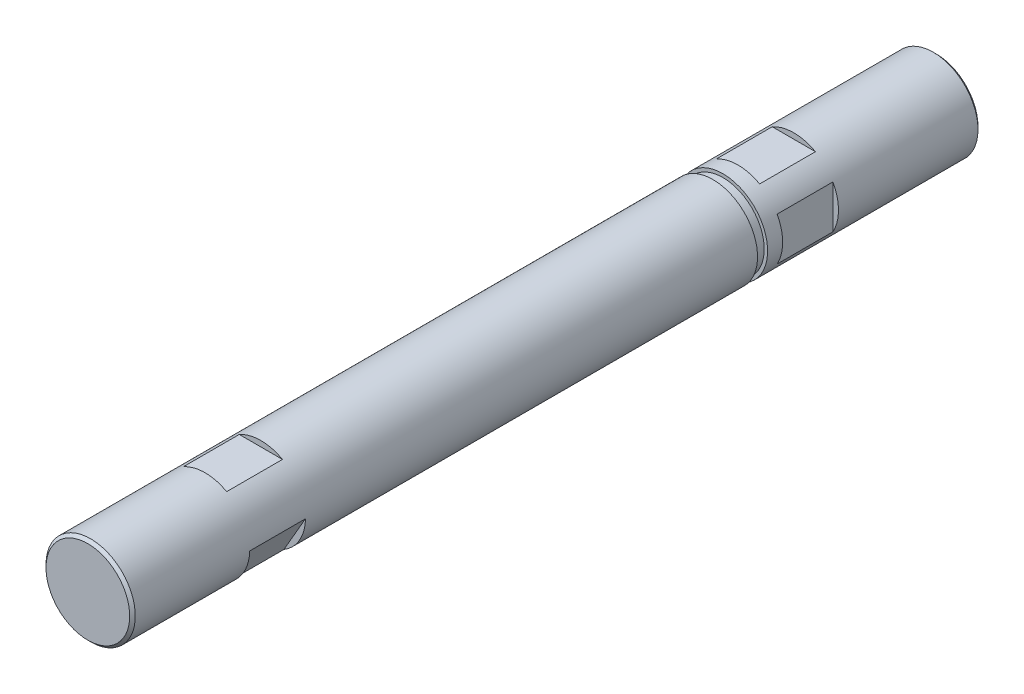
ISO-10303-21;
HEADER;
FILE_DESCRIPTION(('STEP AP214'),'2;1');
FILE_NAME('part.step','',(''),(''),'','','');
FILE_SCHEMA(('AUTOMOTIVE_DESIGN { 1 0 10303 214 1 1 1 1 }'));
ENDSEC;
DATA;
#1=APPLICATION_CONTEXT('core data for automotive mechanical design processes');
#2=APPLICATION_PROTOCOL_DEFINITION('international standard','automotive_design',2000,#1);
#3=PRODUCT_CONTEXT('',#1,'mechanical');
#4=PRODUCT('Part','Part','',(#3));
#5=PRODUCT_RELATED_PRODUCT_CATEGORY('part','',(#4));
#6=PRODUCT_DEFINITION_FORMATION('','',#4);
#7=PRODUCT_DEFINITION_CONTEXT('part definition',#1,'design');
#8=PRODUCT_DEFINITION('design','',#6,#7);
#9=PRODUCT_DEFINITION_SHAPE('','',#8);
#10=(LENGTH_UNIT() NAMED_UNIT(*) SI_UNIT(.MILLI.,.METRE.));
#11=(NAMED_UNIT(*) PLANE_ANGLE_UNIT() SI_UNIT($,.RADIAN.));
#12=(NAMED_UNIT(*) SI_UNIT($,.STERADIAN.) SOLID_ANGLE_UNIT());
#13=UNCERTAINTY_MEASURE_WITH_UNIT(LENGTH_MEASURE(1.E-05),#10,'distance_accuracy_value','');
#14=(GEOMETRIC_REPRESENTATION_CONTEXT(3) GLOBAL_UNCERTAINTY_ASSIGNED_CONTEXT((#13)) GLOBAL_UNIT_ASSIGNED_CONTEXT((#10,
#11,#12)) REPRESENTATION_CONTEXT('',''));
#15=CARTESIAN_POINT('',(0.,0.,0.));
#16=DIRECTION('',(0.,0.,1.));
#17=DIRECTION('',(1.,0.,0.));
#18=AXIS2_PLACEMENT_3D('',#15,#16,#17);
#19=CARTESIAN_POINT('',(0.,0.,0.));
#20=DIRECTION('',(0.,0.,1.));
#21=DIRECTION('',(1.,0.,0.));
#22=AXIS2_PLACEMENT_3D('',#19,#20,#21);
#23=PLANE('',#22);
#24=CARTESIAN_POINT('',(0.,0.,0.));
#25=DIRECTION('',(0.,0.,1.));
#26=DIRECTION('',(1.,0.,0.));
#27=AXIS2_PLACEMENT_3D('',#24,#25,#26);
#28=CIRCLE('',#27,3.75000000002501);
#29=CARTESIAN_POINT('',(3.75000000002501,0.,0.));
#30=VERTEX_POINT('',#29);
#31=EDGE_CURVE('E20',#30,#30,#28,.T.);
#32=ORIENTED_EDGE('',*,*,#31,.F.);
#33=EDGE_LOOP('',(#32));
#34=FACE_BOUND('',#33,.T.);
#35=ADVANCED_FACE('F17',(#34),#23,.F.);
#36=CARTESIAN_POINT('',(-4.,4.78437529436902,12.75));
#37=DIRECTION('',(0.,0.,-1.));
#38=DIRECTION('',(-1.,0.,0.));
#39=AXIS2_PLACEMENT_3D('',#36,#37,#38);
#40=PLANE('',#39);
#41=CARTESIAN_POINT('',(0.,0.,12.75));
#42=DIRECTION('',(0.,0.,-1.));
#43=DIRECTION('',(-1.,0.,0.));
#44=AXIS2_PLACEMENT_3D('',#41,#42,#43);
#45=CIRCLE('',#44,4.);
#46=CARTESIAN_POINT('',(-1.93649167310371,3.5,12.75));
#47=VERTEX_POINT('',#46);
#48=CARTESIAN_POINT('',(1.93649167310372,3.5,12.75));
#49=VERTEX_POINT('',#48);
#50=EDGE_CURVE('E104',#47,#49,#45,.T.);
#51=ORIENTED_EDGE('',*,*,#50,.F.);
#52=DIRECTION('',(1.,0.,0.));
#53=VECTOR('',#52,1.);
#54=CARTESIAN_POINT('',(-4.,3.5,12.75));
#55=LINE('',#54,#53);
#56=EDGE_CURVE('E108',#47,#49,#55,.T.);
#57=ORIENTED_EDGE('',*,*,#56,.T.);
#58=EDGE_LOOP('',(#51,#57));
#59=FACE_BOUND('',#58,.T.);
#60=ADVANCED_FACE('F361',(#59),#40,.F.);
#61=CARTESIAN_POINT('',(-4.,3.5,12.75));
#62=DIRECTION('',(0.,-1.,0.));
#63=DIRECTION('',(0.,0.,-1.));
#64=AXIS2_PLACEMENT_3D('',#61,#62,#63);
#65=PLANE('',#64);
#66=DIRECTION('',(0.,0.,-1.));
#67=VECTOR('',#66,1.);
#68=CARTESIAN_POINT('',(1.93649167310372,3.49999999999999,76.));
#69=LINE('',#68,#67);
#70=CARTESIAN_POINT('',(1.93649167310372,3.5,17.75));
#71=VERTEX_POINT('',#70);
#72=EDGE_CURVE('E143',#49,#71,#69,.F.);
#73=ORIENTED_EDGE('',*,*,#72,.F.);
#74=ORIENTED_EDGE('',*,*,#56,.F.);
#75=DIRECTION('',(0.,0.,-1.));
#76=VECTOR('',#75,1.);
#77=CARTESIAN_POINT('',(-1.93649167310371,3.5,76.));
#78=LINE('',#77,#76);
#79=CARTESIAN_POINT('',(-1.93649167310371,3.5,17.75));
#80=VERTEX_POINT('',#79);
#81=EDGE_CURVE('E101',#80,#47,#78,.T.);
#82=ORIENTED_EDGE('',*,*,#81,.F.);
#83=DIRECTION('',(1.,0.,0.));
#84=VECTOR('',#83,1.);
#85=CARTESIAN_POINT('',(-4.,3.5,17.75));
#86=LINE('',#85,#84);
#87=EDGE_CURVE('E151',#80,#71,#86,.T.);
#88=ORIENTED_EDGE('',*,*,#87,.T.);
#89=EDGE_LOOP('',(#73,#74,#82,#88));
#90=FACE_BOUND('',#89,.T.);
#91=ADVANCED_FACE('F352',(#90),#65,.F.);
#92=CARTESIAN_POINT('',(-4.,4.78437529436902,17.75));
#93=DIRECTION('',(0.,0.,1.));
#94=DIRECTION('',(1.,0.,0.));
#95=AXIS2_PLACEMENT_3D('',#92,#93,#94);
#96=PLANE('',#95);
#97=CARTESIAN_POINT('',(0.,0.,17.75));
#98=DIRECTION('',(0.,0.,-1.));
#99=DIRECTION('',(-1.,0.,0.));
#100=AXIS2_PLACEMENT_3D('',#97,#98,#99);
#101=CIRCLE('',#100,4.);
#102=EDGE_CURVE('E141',#71,#80,#101,.F.);
#103=ORIENTED_EDGE('',*,*,#102,.F.);
#104=ORIENTED_EDGE('',*,*,#87,.F.);
#105=EDGE_LOOP('',(#103,#104));
#106=FACE_BOUND('',#105,.T.);
#107=ADVANCED_FACE('F344',(#106),#96,.F.);
#108=CARTESIAN_POINT('',(4.78437529436903,3.99999999999998,17.75));
#109=DIRECTION('',(0.,0.,1.));
#110=DIRECTION('',(1.,0.,0.));
#111=AXIS2_PLACEMENT_3D('',#108,#109,#110);
#112=PLANE('',#111);
#113=CARTESIAN_POINT('',(0.,0.,17.75));
#114=DIRECTION('',(0.,0.,-1.));
#115=DIRECTION('',(-1.,0.,0.));
#116=AXIS2_PLACEMENT_3D('',#113,#114,#115);
#117=CIRCLE('',#116,4.);
#118=CARTESIAN_POINT('',(3.49999999999999,-1.93649167310373,17.75));
#119=VERTEX_POINT('',#118);
#120=CARTESIAN_POINT('',(3.5,1.9364916731037,17.75));
#121=VERTEX_POINT('',#120);
#122=EDGE_CURVE('E77',#119,#121,#117,.F.);
#123=ORIENTED_EDGE('',*,*,#122,.F.);
#124=DIRECTION('',(0.,-1.,0.));
#125=VECTOR('',#124,1.);
#126=CARTESIAN_POINT('',(3.50000000000001,3.99999999999999,17.75));
#127=LINE('',#126,#125);
#128=EDGE_CURVE('E98',#119,#121,#127,.F.);
#129=ORIENTED_EDGE('',*,*,#128,.T.);
#130=EDGE_LOOP('',(#123,#129));
#131=FACE_BOUND('',#130,.T.);
#132=ADVANCED_FACE('F336',(#131),#112,.F.);
#133=CARTESIAN_POINT('',(3.50000000000001,3.99999999999999,12.75));
#134=DIRECTION('',(-1.,0.,0.));
#135=DIRECTION('',(0.,-1.,0.));
#136=AXIS2_PLACEMENT_3D('',#133,#134,#135);
#137=PLANE('',#136);
#138=DIRECTION('',(0.,0.,-1.));
#139=VECTOR('',#138,1.);
#140=CARTESIAN_POINT('',(3.49999999999999,-1.93649167310373,76.));
#141=LINE('',#140,#139);
#142=CARTESIAN_POINT('',(3.49999999999999,-1.93649167310373,12.75));
#143=VERTEX_POINT('',#142);
#144=EDGE_CURVE('E89',#143,#119,#141,.F.);
#145=ORIENTED_EDGE('',*,*,#144,.F.);
#146=DIRECTION('',(0.,1.,0.));
#147=VECTOR('',#146,1.);
#148=CARTESIAN_POINT('',(3.49999999999999,3.99999999999998,12.75));
#149=LINE('',#148,#147);
#150=CARTESIAN_POINT('',(3.5,1.93649167310371,12.75));
#151=VERTEX_POINT('',#150);
#152=EDGE_CURVE('E95',#143,#151,#149,.T.);
#153=ORIENTED_EDGE('',*,*,#152,.T.);
#154=DIRECTION('',(0.,0.,-1.));
#155=VECTOR('',#154,1.);
#156=CARTESIAN_POINT('',(3.5,1.9364916731037,76.));
#157=LINE('',#156,#155);
#158=EDGE_CURVE('E91',#121,#151,#157,.T.);
#159=ORIENTED_EDGE('',*,*,#158,.F.);
#160=ORIENTED_EDGE('',*,*,#128,.F.);
#161=EDGE_LOOP('',(#145,#153,#159,#160));
#162=FACE_BOUND('',#161,.T.);
#163=ADVANCED_FACE('F100',(#162),#137,.F.);
#164=CARTESIAN_POINT('',(4.78437529436903,3.99999999999998,12.75));
#165=DIRECTION('',(0.,0.,-1.));
#166=DIRECTION('',(-1.,0.,0.));
#167=AXIS2_PLACEMENT_3D('',#164,#165,#166);
#168=PLANE('',#167);
#169=ORIENTED_EDGE('',*,*,#152,.F.);
#170=CARTESIAN_POINT('',(0.,0.,12.75));
#171=DIRECTION('',(0.,0.,-1.));
#172=DIRECTION('',(-1.,0.,0.));
#173=AXIS2_PLACEMENT_3D('',#170,#171,#172);
#174=CIRCLE('',#173,4.);
#175=EDGE_CURVE('E84',#151,#143,#174,.T.);
#176=ORIENTED_EDGE('',*,*,#175,.F.);
#177=EDGE_LOOP('',(#169,#176));
#178=FACE_BOUND('',#177,.T.);
#179=ADVANCED_FACE('F96',(#178),#168,.F.);
#180=CARTESIAN_POINT('',(0.,0.,0.249999999994088));
#181=DIRECTION('',(0.,0.,1.));
#182=DIRECTION('',(1.,0.,0.));
#183=AXIS2_PLACEMENT_3D('',#180,#181,#182);
#184=CONICAL_SURFACE('',#183,4.0000000000191,0.785398163397448);
#185=CARTESIAN_POINT('',(0.,0.,0.250000000000028));
#186=DIRECTION('',(0.,0.,-1.));
#187=DIRECTION('',(-1.,0.,0.));
#188=AXIS2_PLACEMENT_3D('',#185,#186,#187);
#189=CIRCLE('',#188,4.);
#190=CARTESIAN_POINT('',(-4.,0.,0.250000000000028));
#191=VERTEX_POINT('',#190);
#192=EDGE_CURVE('E93',#191,#191,#189,.F.);
#193=ORIENTED_EDGE('',*,*,#192,.F.);
#194=EDGE_LOOP('',(#193));
#195=FACE_BOUND('',#194,.T.);
#196=ORIENTED_EDGE('',*,*,#31,.T.);
#197=EDGE_LOOP('',(#196));
#198=FACE_BOUND('',#197,.T.);
#199=ADVANCED_FACE('F313',(#195,#198),#184,.T.);
#200=CARTESIAN_POINT('',(0.,0.,76.));
#201=DIRECTION('',(0.,0.,-1.));
#202=DIRECTION('',(-1.,0.,0.));
#203=AXIS2_PLACEMENT_3D('',#200,#201,#202);
#204=CYLINDRICAL_SURFACE('',#203,4.);
#205=ORIENTED_EDGE('',*,*,#144,.T.);
#206=ORIENTED_EDGE('',*,*,#122,.T.);
#207=ORIENTED_EDGE('',*,*,#158,.T.);
#208=ORIENTED_EDGE('',*,*,#175,.T.);
#209=EDGE_LOOP('',(#205,#206,#207,#208));
#210=FACE_BOUND('',#209,.T.);
#211=ORIENTED_EDGE('',*,*,#192,.T.);
#212=EDGE_LOOP('',(#211));
#213=FACE_BOUND('',#212,.T.);
#214=CARTESIAN_POINT('',(0.,0.,19.1));
#215=DIRECTION('',(0.,0.,-1.));
#216=DIRECTION('',(-1.,0.,0.));
#217=AXIS2_PLACEMENT_3D('',#214,#215,#216);
#218=CIRCLE('',#217,4.);
#219=CARTESIAN_POINT('',(-4.,0.,19.1));
#220=VERTEX_POINT('',#219);
#221=EDGE_CURVE('E137',#220,#220,#218,.T.);
#222=ORIENTED_EDGE('',*,*,#221,.T.);
#223=EDGE_LOOP('',(#222));
#224=FACE_BOUND('',#223,.T.);
#225=ORIENTED_EDGE('',*,*,#72,.T.);
#226=ORIENTED_EDGE('',*,*,#102,.T.);
#227=ORIENTED_EDGE('',*,*,#81,.T.);
#228=ORIENTED_EDGE('',*,*,#50,.T.);
#229=EDGE_LOOP('',(#225,#226,#227,#228));
#230=FACE_BOUND('',#229,.T.);
#231=ADVANCED_FACE('F86',(#210,#213,#224,#230),#204,.T.);
#232=CARTESIAN_POINT('',(0.,4.65162859314815,19.1));
#233=DIRECTION('',(0.,0.,-1.));
#234=DIRECTION('',(-1.,0.,0.));
#235=AXIS2_PLACEMENT_3D('',#232,#233,#234);
#236=PLANE('',#235);
#237=ORIENTED_EDGE('',*,*,#221,.F.);
#238=EDGE_LOOP('',(#237));
#239=FACE_BOUND('',#238,.T.);
#240=CARTESIAN_POINT('',(0.,0.,19.1));
#241=DIRECTION('',(0.,0.,-1.));
#242=DIRECTION('',(-1.,0.,0.));
#243=AXIS2_PLACEMENT_3D('',#240,#241,#242);
#244=CIRCLE('',#243,3.7);
#245=CARTESIAN_POINT('',(-3.7,0.,19.1));
#246=VERTEX_POINT('',#245);
#247=EDGE_CURVE('E133',#246,#246,#244,.F.);
#248=ORIENTED_EDGE('',*,*,#247,.F.);
#249=EDGE_LOOP('',(#248));
#250=FACE_BOUND('',#249,.T.);
#251=ADVANCED_FACE('F187',(#239,#250),#236,.F.);
#252=CARTESIAN_POINT('',(0.,0.,76.));
#253=DIRECTION('',(0.,0.,1.));
#254=DIRECTION('',(1.,0.,0.));
#255=AXIS2_PLACEMENT_3D('',#252,#253,#254);
#256=PLANE('',#255);
#257=CARTESIAN_POINT('',(0.,0.,76.0000000000787));
#258=DIRECTION('',(0.,0.,-1.));
#259=DIRECTION('',(-1.,0.,0.));
#260=AXIS2_PLACEMENT_3D('',#257,#258,#259);
#261=CIRCLE('',#260,3.75000000002501);
#262=CARTESIAN_POINT('',(-3.75000000002501,0.,76.0000000000787));
#263=VERTEX_POINT('',#262);
#264=EDGE_CURVE('E129',#263,#263,#261,.T.);
#265=ORIENTED_EDGE('',*,*,#264,.F.);
#266=EDGE_LOOP('',(#265));
#267=FACE_BOUND('',#266,.T.);
#268=ADVANCED_FACE('F184',(#267),#256,.T.);
#269=CARTESIAN_POINT('',(0.,0.,-3.));
#270=DIRECTION('',(0.,0.,-1.));
#271=DIRECTION('',(-1.,0.,0.));
#272=AXIS2_PLACEMENT_3D('',#269,#270,#271);
#273=CYLINDRICAL_SURFACE('',#272,3.7);
#274=ORIENTED_EDGE('',*,*,#247,.T.);
#275=EDGE_LOOP('',(#274));
#276=FACE_BOUND('',#275,.T.);
#277=CARTESIAN_POINT('',(0.,0.,20.));
#278=DIRECTION('',(0.,0.,-1.));
#279=DIRECTION('',(-1.,0.,0.));
#280=AXIS2_PLACEMENT_3D('',#277,#278,#279);
#281=CIRCLE('',#280,3.7);
#282=CARTESIAN_POINT('',(-3.7,0.,20.));
#283=VERTEX_POINT('',#282);
#284=EDGE_CURVE('E126',#283,#283,#281,.T.);
#285=ORIENTED_EDGE('',*,*,#284,.T.);
#286=EDGE_LOOP('',(#285));
#287=FACE_BOUND('',#286,.T.);
#288=ADVANCED_FACE('F186',(#276,#287),#273,.T.);
#289=CARTESIAN_POINT('',(5.68822894956329,0.18000109989514,65.5));
#290=DIRECTION('',(0.,0.,1.));
#291=DIRECTION('',(1.,0.,0.));
#292=AXIS2_PLACEMENT_3D('',#289,#290,#291);
#293=PLANE('',#292);
#294=CARTESIAN_POINT('',(0.,0.,65.5));
#295=DIRECTION('',(0.,0.,-1.));
#296=DIRECTION('',(-1.,0.,0.));
#297=AXIS2_PLACEMENT_3D('',#294,#295,#296);
#298=CIRCLE('',#297,4.);
#299=CARTESIAN_POINT('',(2.06284307669367,-3.42705098312485,65.5));
#300=VERTEX_POINT('',#299);
#301=CARTESIAN_POINT('',(3.99933474979739,-0.0729490168751774,65.5));
#302=VERTEX_POINT('',#301);
#303=EDGE_CURVE('E123',#300,#302,#298,.F.);
#304=ORIENTED_EDGE('',*,*,#303,.F.);
#305=DIRECTION('',(-0.500000000000004,-0.866025403784436,0.));
#306=VECTOR('',#305,1.);
#307=CARTESIAN_POINT('',(4.53108891324554,0.848076211353295,65.5));
#308=LINE('',#307,#306);
#309=EDGE_CURVE('E157',#300,#302,#308,.F.);
#310=ORIENTED_EDGE('',*,*,#309,.T.);
#311=EDGE_LOOP('',(#304,#310));
#312=FACE_BOUND('',#311,.T.);
#313=ADVANCED_FACE('F194',(#312),#293,.F.);
#314=CARTESIAN_POINT('',(5.68822894956329,0.18000109989514,60.5));
#315=DIRECTION('',(0.,0.,-1.));
#316=DIRECTION('',(-1.,0.,0.));
#317=AXIS2_PLACEMENT_3D('',#314,#315,#316);
#318=PLANE('',#317);
#319=CARTESIAN_POINT('',(0.,0.,60.5));
#320=DIRECTION('',(0.,0.,-1.));
#321=DIRECTION('',(-1.,0.,0.));
#322=AXIS2_PLACEMENT_3D('',#319,#320,#321);
#323=CIRCLE('',#322,4.);
#324=CARTESIAN_POINT('',(3.99933474979739,-0.0729490168751774,60.5));
#325=VERTEX_POINT('',#324);
#326=CARTESIAN_POINT('',(2.06284307669367,-3.42705098312485,60.5));
#327=VERTEX_POINT('',#326);
#328=EDGE_CURVE('E119',#325,#327,#323,.T.);
#329=ORIENTED_EDGE('',*,*,#328,.F.);
#330=DIRECTION('',(-0.500000000000004,-0.866025403784436,0.));
#331=VECTOR('',#330,1.);
#332=CARTESIAN_POINT('',(4.53108891324554,0.848076211353295,60.5));
#333=LINE('',#332,#331);
#334=EDGE_CURVE('E136',#325,#327,#333,.T.);
#335=ORIENTED_EDGE('',*,*,#334,.T.);
#336=EDGE_LOOP('',(#329,#335));
#337=FACE_BOUND('',#336,.T.);
#338=ADVANCED_FACE('F221',(#337),#318,.F.);
#339=CARTESIAN_POINT('',(4.53108891324554,0.848076211353295,65.5));
#340=DIRECTION('',(-0.866025403784436,0.500000000000004,0.));
#341=DIRECTION('',(-0.500000000000004,-0.866025403784436,0.));
#342=AXIS2_PLACEMENT_3D('',#339,#340,#341);
#343=PLANE('',#342);
#344=DIRECTION('',(0.,0.,-1.));
#345=VECTOR('',#344,1.);
#346=CARTESIAN_POINT('',(2.06284307669367,-3.42705098312485,76.));
#347=LINE('',#346,#345);
#348=EDGE_CURVE('E118',#327,#300,#347,.F.);
#349=ORIENTED_EDGE('',*,*,#348,.F.);
#350=ORIENTED_EDGE('',*,*,#334,.F.);
#351=DIRECTION('',(0.,0.,-1.));
#352=VECTOR('',#351,1.);
#353=CARTESIAN_POINT('',(3.99933474979739,-0.0729490168751766,76.));
#354=LINE('',#353,#352);
#355=EDGE_CURVE('E122',#302,#325,#354,.T.);
#356=ORIENTED_EDGE('',*,*,#355,.F.);
#357=ORIENTED_EDGE('',*,*,#309,.F.);
#358=EDGE_LOOP('',(#349,#350,#356,#357));
#359=FACE_BOUND('',#358,.T.);
#360=ADVANCED_FACE('F217',(#359),#343,.F.);
#361=CARTESIAN_POINT('',(-3.,4.8361502229163,65.5));
#362=DIRECTION('',(0.,0.,1.));
#363=DIRECTION('',(1.,0.,0.));
#364=AXIS2_PLACEMENT_3D('',#361,#362,#363);
#365=PLANE('',#364);
#366=CARTESIAN_POINT('',(0.,0.,65.5));
#367=DIRECTION('',(0.,0.,-1.));
#368=DIRECTION('',(-1.,0.,0.));
#369=AXIS2_PLACEMENT_3D('',#366,#367,#368);
#370=CIRCLE('',#369,4.);
#371=CARTESIAN_POINT('',(1.93649167310371,3.5,65.5));
#372=VERTEX_POINT('',#371);
#373=CARTESIAN_POINT('',(-1.93649167310371,3.5,65.5));
#374=VERTEX_POINT('',#373);
#375=EDGE_CURVE('E115',#372,#374,#370,.F.);
#376=ORIENTED_EDGE('',*,*,#375,.F.);
#377=DIRECTION('',(1.,0.,0.));
#378=VECTOR('',#377,1.);
#379=CARTESIAN_POINT('',(-3.,3.5,65.5));
#380=LINE('',#379,#378);
#381=EDGE_CURVE('E132',#372,#374,#380,.F.);
#382=ORIENTED_EDGE('',*,*,#381,.T.);
#383=EDGE_LOOP('',(#376,#382));
#384=FACE_BOUND('',#383,.T.);
#385=ADVANCED_FACE('F214',(#384),#365,.F.);
#386=CARTESIAN_POINT('',(-3.,4.8361502229163,60.5));
#387=DIRECTION('',(0.,0.,-1.));
#388=DIRECTION('',(-1.,0.,0.));
#389=AXIS2_PLACEMENT_3D('',#386,#387,#388);
#390=PLANE('',#389);
#391=CARTESIAN_POINT('',(0.,0.,60.5));
#392=DIRECTION('',(0.,0.,-1.));
#393=DIRECTION('',(-1.,0.,0.));
#394=AXIS2_PLACEMENT_3D('',#391,#392,#393);
#395=CIRCLE('',#394,4.);
#396=CARTESIAN_POINT('',(-1.93649167310371,3.5,60.5));
#397=VERTEX_POINT('',#396);
#398=CARTESIAN_POINT('',(1.93649167310371,3.5,60.5));
#399=VERTEX_POINT('',#398);
#400=EDGE_CURVE('E110',#397,#399,#395,.T.);
#401=ORIENTED_EDGE('',*,*,#400,.F.);
#402=DIRECTION('',(1.,0.,0.));
#403=VECTOR('',#402,1.);
#404=CARTESIAN_POINT('',(-3.,3.5,60.5));
#405=LINE('',#404,#403);
#406=EDGE_CURVE('E34',#397,#399,#405,.T.);
#407=ORIENTED_EDGE('',*,*,#406,.T.);
#408=EDGE_LOOP('',(#401,#407));
#409=FACE_BOUND('',#408,.T.);
#410=ADVANCED_FACE('F210',(#409),#390,.F.);
#411=CARTESIAN_POINT('',(-3.,3.5,65.5));
#412=DIRECTION('',(0.,-1.,0.));
#413=DIRECTION('',(0.,0.,-1.));
#414=AXIS2_PLACEMENT_3D('',#411,#412,#413);
#415=PLANE('',#414);
#416=DIRECTION('',(0.,0.,-1.));
#417=VECTOR('',#416,1.);
#418=CARTESIAN_POINT('',(1.93649167310371,3.5,76.));
#419=LINE('',#418,#417);
#420=EDGE_CURVE('E113',#399,#372,#419,.F.);
#421=ORIENTED_EDGE('',*,*,#420,.F.);
#422=ORIENTED_EDGE('',*,*,#406,.F.);
#423=DIRECTION('',(0.,0.,-1.));
#424=VECTOR('',#423,1.);
#425=CARTESIAN_POINT('',(-1.93649167310371,3.5,76.));
#426=LINE('',#425,#424);
#427=EDGE_CURVE('E114',#374,#397,#426,.T.);
#428=ORIENTED_EDGE('',*,*,#427,.F.);
#429=ORIENTED_EDGE('',*,*,#381,.F.);
#430=EDGE_LOOP('',(#421,#422,#428,#429));
#431=FACE_BOUND('',#430,.T.);
#432=ADVANCED_FACE('F180',(#431),#415,.F.);
#433=CARTESIAN_POINT('',(0.,0.,75.7500000000846));
#434=DIRECTION('',(0.,0.,-1.));
#435=DIRECTION('',(-1.,0.,0.));
#436=AXIS2_PLACEMENT_3D('',#433,#434,#435);
#437=CONICAL_SURFACE('',#436,4.0000000000191,0.785398163397448);
#438=CARTESIAN_POINT('',(0.,0.,75.75));
#439=DIRECTION('',(0.,0.,-1.));
#440=DIRECTION('',(-1.,0.,0.));
#441=AXIS2_PLACEMENT_3D('',#438,#439,#440);
#442=CIRCLE('',#441,4.);
#443=CARTESIAN_POINT('',(-4.,0.,75.75));
#444=VERTEX_POINT('',#443);
#445=EDGE_CURVE('E26',#444,#444,#442,.T.);
#446=ORIENTED_EDGE('',*,*,#445,.F.);
#447=EDGE_LOOP('',(#446));
#448=FACE_BOUND('',#447,.T.);
#449=ORIENTED_EDGE('',*,*,#264,.T.);
#450=EDGE_LOOP('',(#449));
#451=FACE_BOUND('',#450,.T.);
#452=ADVANCED_FACE('F176',(#448,#451),#437,.T.);
#453=CARTESIAN_POINT('',(0.,4.65162859314815,20.));
#454=DIRECTION('',(0.,0.,1.));
#455=DIRECTION('',(1.,0.,0.));
#456=AXIS2_PLACEMENT_3D('',#453,#454,#455);
#457=PLANE('',#456);
#458=CARTESIAN_POINT('',(0.,0.,20.));
#459=DIRECTION('',(0.,0.,-1.));
#460=DIRECTION('',(-1.,0.,0.));
#461=AXIS2_PLACEMENT_3D('',#458,#459,#460);
#462=CIRCLE('',#461,4.);
#463=CARTESIAN_POINT('',(-4.,0.,20.));
#464=VERTEX_POINT('',#463);
#465=EDGE_CURVE('E11',#464,#464,#462,.F.);
#466=ORIENTED_EDGE('',*,*,#465,.F.);
#467=EDGE_LOOP('',(#466));
#468=FACE_BOUND('',#467,.T.);
#469=ORIENTED_EDGE('',*,*,#284,.F.);
#470=EDGE_LOOP('',(#469));
#471=FACE_BOUND('',#470,.T.);
#472=ADVANCED_FACE('F179',(#468,#471),#457,.F.);
#473=CARTESIAN_POINT('',(0.,0.,76.));
#474=DIRECTION('',(0.,0.,-1.));
#475=DIRECTION('',(-1.,0.,0.));
#476=AXIS2_PLACEMENT_3D('',#473,#474,#475);
#477=CYLINDRICAL_SURFACE('',#476,4.);
#478=ORIENTED_EDGE('',*,*,#465,.T.);
#479=EDGE_LOOP('',(#478));
#480=FACE_BOUND('',#479,.T.);
#481=ORIENTED_EDGE('',*,*,#445,.T.);
#482=EDGE_LOOP('',(#481));
#483=FACE_BOUND('',#482,.T.);
#484=ORIENTED_EDGE('',*,*,#400,.T.);
#485=ORIENTED_EDGE('',*,*,#420,.T.);
#486=ORIENTED_EDGE('',*,*,#375,.T.);
#487=ORIENTED_EDGE('',*,*,#427,.T.);
#488=EDGE_LOOP('',(#484,#485,#486,#487));
#489=FACE_BOUND('',#488,.T.);
#490=ORIENTED_EDGE('',*,*,#328,.T.);
#491=ORIENTED_EDGE('',*,*,#348,.T.);
#492=ORIENTED_EDGE('',*,*,#303,.T.);
#493=ORIENTED_EDGE('',*,*,#355,.T.);
#494=EDGE_LOOP('',(#490,#491,#492,#493));
#495=FACE_BOUND('',#494,.T.);
#496=ADVANCED_FACE('F173',(#480,#483,#489,#495),#477,.T.);
#497=CLOSED_SHELL('',(#35,#60,#91,#107,#132,#163,#179,#199,#231,#251,#268,#288,#313,#338,#360,
#385,#410,#432,#452,#472,#496));
#498=MANIFOLD_SOLID_BREP('B1',#497);
#499=ADVANCED_BREP_SHAPE_REPRESENTATION('',(#18,#498),#14);
#500=SHAPE_DEFINITION_REPRESENTATION(#9,#499);
ENDSEC;
END-ISO-10303-21;
